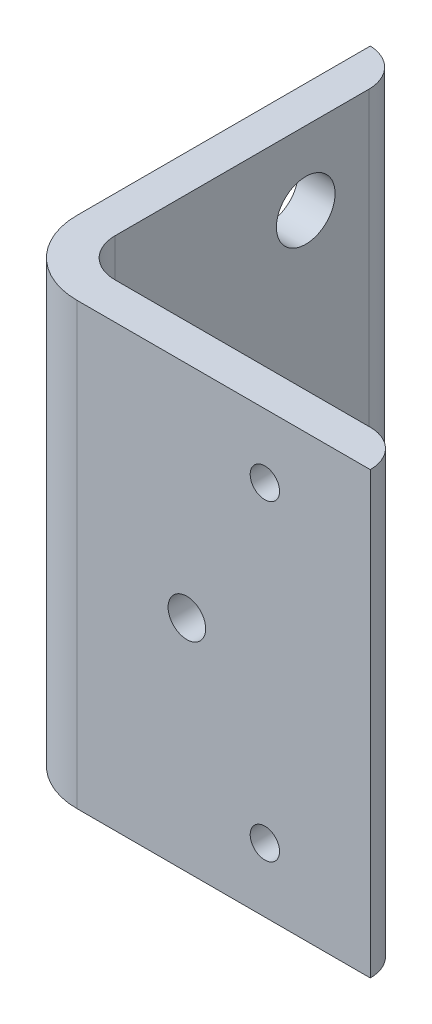
ISO-10303-21;
HEADER;
FILE_DESCRIPTION(('STEP AP214'),'2;1');
FILE_NAME('part.step','',(''),(''),'','','');
FILE_SCHEMA(('AUTOMOTIVE_DESIGN { 1 0 10303 214 1 1 1 1 }'));
ENDSEC;
DATA;
#1=APPLICATION_CONTEXT('core data for automotive mechanical design processes');
#2=APPLICATION_PROTOCOL_DEFINITION('international standard','automotive_design',2000,#1);
#3=PRODUCT_CONTEXT('',#1,'mechanical');
#4=PRODUCT('Part','Part','',(#3));
#5=PRODUCT_RELATED_PRODUCT_CATEGORY('part','',(#4));
#6=PRODUCT_DEFINITION_FORMATION('','',#4);
#7=PRODUCT_DEFINITION_CONTEXT('part definition',#1,'design');
#8=PRODUCT_DEFINITION('design','',#6,#7);
#9=PRODUCT_DEFINITION_SHAPE('','',#8);
#10=(LENGTH_UNIT() NAMED_UNIT(*) SI_UNIT(.MILLI.,.METRE.));
#11=(NAMED_UNIT(*) PLANE_ANGLE_UNIT() SI_UNIT($,.RADIAN.));
#12=(NAMED_UNIT(*) SI_UNIT($,.STERADIAN.) SOLID_ANGLE_UNIT());
#13=UNCERTAINTY_MEASURE_WITH_UNIT(LENGTH_MEASURE(1.E-05),#10,'distance_accuracy_value','');
#14=(GEOMETRIC_REPRESENTATION_CONTEXT(3) GLOBAL_UNCERTAINTY_ASSIGNED_CONTEXT((#13)) GLOBAL_UNIT_ASSIGNED_CONTEXT((#10,
#11,#12)) REPRESENTATION_CONTEXT('',''));
#15=CARTESIAN_POINT('',(0.,0.,0.));
#16=DIRECTION('',(0.,0.,1.));
#17=DIRECTION('',(1.,0.,0.));
#18=AXIS2_PLACEMENT_3D('',#15,#16,#17);
#19=CARTESIAN_POINT('',(-12.7,12.7,-19.812));
#20=DIRECTION('',(1.,0.,0.));
#21=DIRECTION('',(0.,0.,-1.));
#22=AXIS2_PLACEMENT_3D('',#19,#20,#21);
#23=CYLINDRICAL_SURFACE('',#22,2.54);
#24=CARTESIAN_POINT('',(-12.7,12.7,-19.812));
#25=DIRECTION('',(1.,0.,0.));
#26=DIRECTION('',(0.,0.,-1.));
#27=AXIS2_PLACEMENT_3D('',#24,#25,#26);
#28=CIRCLE('',#27,2.54);
#29=CARTESIAN_POINT('',(-12.7,12.7,-22.352));
#30=VERTEX_POINT('',#29);
#31=EDGE_CURVE('E19',#30,#30,#28,.F.);
#32=ORIENTED_EDGE('',*,*,#31,.F.);
#33=EDGE_LOOP('',(#32));
#34=FACE_BOUND('',#33,.T.);
#35=CARTESIAN_POINT('',(-15.875,12.7,-19.812));
#36=DIRECTION('',(1.,0.,0.));
#37=DIRECTION('',(0.,0.,-1.));
#38=AXIS2_PLACEMENT_3D('',#35,#36,#37);
#39=CIRCLE('',#38,2.54);
#40=CARTESIAN_POINT('',(-15.875,12.7,-22.352));
#41=VERTEX_POINT('',#40);
#42=EDGE_CURVE('E113',#41,#41,#39,.T.);
#43=ORIENTED_EDGE('',*,*,#42,.F.);
#44=EDGE_LOOP('',(#43));
#45=FACE_BOUND('',#44,.T.);
#46=ADVANCED_FACE('F16',(#34,#45),#23,.F.);
#47=CARTESIAN_POINT('',(-12.7,-12.7,-19.812));
#48=DIRECTION('',(1.,0.,0.));
#49=DIRECTION('',(0.,0.,-1.));
#50=AXIS2_PLACEMENT_3D('',#47,#48,#49);
#51=CYLINDRICAL_SURFACE('',#50,2.54);
#52=CARTESIAN_POINT('',(-12.7,-12.7,-19.812));
#53=DIRECTION('',(1.,0.,0.));
#54=DIRECTION('',(0.,0.,-1.));
#55=AXIS2_PLACEMENT_3D('',#52,#53,#54);
#56=CIRCLE('',#55,2.54);
#57=CARTESIAN_POINT('',(-12.7,-12.7,-22.352));
#58=VERTEX_POINT('',#57);
#59=EDGE_CURVE('E116',#58,#58,#56,.F.);
#60=ORIENTED_EDGE('',*,*,#59,.F.);
#61=EDGE_LOOP('',(#60));
#62=FACE_BOUND('',#61,.T.);
#63=CARTESIAN_POINT('',(-15.875,-12.7,-19.812));
#64=DIRECTION('',(1.,0.,0.));
#65=DIRECTION('',(0.,0.,-1.));
#66=AXIS2_PLACEMENT_3D('',#63,#64,#65);
#67=CIRCLE('',#66,2.54);
#68=CARTESIAN_POINT('',(-15.875,-12.7,-22.352));
#69=VERTEX_POINT('',#68);
#70=EDGE_CURVE('E92',#69,#69,#67,.T.);
#71=ORIENTED_EDGE('',*,*,#70,.F.);
#72=EDGE_LOOP('',(#71));
#73=FACE_BOUND('',#72,.T.);
#74=ADVANCED_FACE('F312',(#62,#73),#51,.F.);
#75=CARTESIAN_POINT('',(-9.398,68.71716,-3.302));
#76=DIRECTION('',(0.,-1.,0.));
#77=DIRECTION('',(0.,0.,-1.));
#78=AXIS2_PLACEMENT_3D('',#75,#76,#77);
#79=CYLINDRICAL_SURFACE('',#78,3.302);
#80=DIRECTION('',(0.,1.,0.));
#81=VECTOR('',#80,1.);
#82=CARTESIAN_POINT('',(-12.7,-19.05,-3.302));
#83=LINE('',#82,#81);
#84=CARTESIAN_POINT('',(-12.7,19.05,-3.302));
#85=VERTEX_POINT('',#84);
#86=CARTESIAN_POINT('',(-12.7,-19.05,-3.302));
#87=VERTEX_POINT('',#86);
#88=EDGE_CURVE('E75',#85,#87,#83,.F.);
#89=ORIENTED_EDGE('',*,*,#88,.F.);
#90=CARTESIAN_POINT('',(-9.398,19.05,-3.302));
#91=DIRECTION('',(0.,-1.,0.));
#92=DIRECTION('',(0.,0.,-1.));
#93=AXIS2_PLACEMENT_3D('',#90,#91,#92);
#94=CIRCLE('',#93,3.302);
#95=CARTESIAN_POINT('',(-9.398,19.05,0.));
#96=VERTEX_POINT('',#95);
#97=EDGE_CURVE('E87',#96,#85,#94,.T.);
#98=ORIENTED_EDGE('',*,*,#97,.F.);
#99=DIRECTION('',(0.,1.,0.));
#100=VECTOR('',#99,1.);
#101=CARTESIAN_POINT('',(-9.398,0.,0.));
#102=LINE('',#101,#100);
#103=CARTESIAN_POINT('',(-9.398,-19.05,0.));
#104=VERTEX_POINT('',#103);
#105=EDGE_CURVE('E80',#96,#104,#102,.F.);
#106=ORIENTED_EDGE('',*,*,#105,.T.);
#107=CARTESIAN_POINT('',(-9.398,-19.05,-3.302));
#108=DIRECTION('',(0.,-1.,0.));
#109=DIRECTION('',(0.,0.,-1.));
#110=AXIS2_PLACEMENT_3D('',#107,#108,#109);
#111=CIRCLE('',#110,3.302);
#112=EDGE_CURVE('E84',#87,#104,#111,.F.);
#113=ORIENTED_EDGE('',*,*,#112,.F.);
#114=EDGE_LOOP('',(#89,#98,#106,#113));
#115=FACE_BOUND('',#114,.T.);
#116=ADVANCED_FACE('F82',(#115),#79,.F.);
#117=CARTESIAN_POINT('',(-12.7,-19.05,3.175));
#118=DIRECTION('',(1.,0.,0.));
#119=DIRECTION('',(0.,0.,-1.));
#120=AXIS2_PLACEMENT_3D('',#117,#118,#119);
#121=PLANE('',#120);
#122=ORIENTED_EDGE('',*,*,#59,.T.);
#123=EDGE_LOOP('',(#122));
#124=FACE_BOUND('',#123,.T.);
#125=ORIENTED_EDGE('',*,*,#31,.T.);
#126=EDGE_LOOP('',(#125));
#127=FACE_BOUND('',#126,.T.);
#128=DIRECTION('',(0.,0.,-1.));
#129=VECTOR('',#128,1.);
#130=CARTESIAN_POINT('',(-12.7,-19.05,0.));
#131=LINE('',#130,#129);
#132=CARTESIAN_POINT('',(-12.7,-19.05,-25.2754432115813));
#133=VERTEX_POINT('',#132);
#134=EDGE_CURVE('E91',#133,#87,#131,.F.);
#135=ORIENTED_EDGE('',*,*,#134,.F.);
#136=DIRECTION('',(0.,-1.,0.));
#137=VECTOR('',#136,1.);
#138=CARTESIAN_POINT('',(-12.7,68.9720626903736,-25.2754432115813));
#139=LINE('',#138,#137);
#140=CARTESIAN_POINT('',(-12.7,19.05,-25.2754432115813));
#141=VERTEX_POINT('',#140);
#142=EDGE_CURVE('E118',#141,#133,#139,.T.);
#143=ORIENTED_EDGE('',*,*,#142,.F.);
#144=DIRECTION('',(0.,0.,1.));
#145=VECTOR('',#144,1.);
#146=CARTESIAN_POINT('',(-12.7,19.05,0.));
#147=LINE('',#146,#145);
#148=EDGE_CURVE('E156',#85,#141,#147,.F.);
#149=ORIENTED_EDGE('',*,*,#148,.F.);
#150=ORIENTED_EDGE('',*,*,#88,.T.);
#151=EDGE_LOOP('',(#135,#143,#149,#150));
#152=FACE_BOUND('',#151,.T.);
#153=ADVANCED_FACE('F296',(#124,#127,#152),#121,.T.);
#154=CARTESIAN_POINT('',(-16.002,68.9720626903736,-25.2754432115813));
#155=DIRECTION('',(0.,-1.,0.));
#156=DIRECTION('',(0.,0.,-1.));
#157=AXIS2_PLACEMENT_3D('',#154,#155,#156);
#158=CYLINDRICAL_SURFACE('',#157,3.302);
#159=ORIENTED_EDGE('',*,*,#142,.T.);
#160=CARTESIAN_POINT('',(-16.002,-19.05,-25.2754432115813));
#161=DIRECTION('',(0.,-1.,0.));
#162=DIRECTION('',(0.,0.,-1.));
#163=AXIS2_PLACEMENT_3D('',#160,#161,#162);
#164=CIRCLE('',#163,3.302);
#165=CARTESIAN_POINT('',(-15.875,-19.05,-28.575));
#166=VERTEX_POINT('',#165);
#167=EDGE_CURVE('E109',#166,#133,#164,.T.);
#168=ORIENTED_EDGE('',*,*,#167,.F.);
#169=DIRECTION('',(0.,1.,0.));
#170=VECTOR('',#169,1.);
#171=CARTESIAN_POINT('',(-15.875,19.05,-28.575));
#172=LINE('',#171,#170);
#173=CARTESIAN_POINT('',(-15.875,19.05,-28.575));
#174=VERTEX_POINT('',#173);
#175=EDGE_CURVE('E115',#174,#166,#172,.F.);
#176=ORIENTED_EDGE('',*,*,#175,.F.);
#177=CARTESIAN_POINT('',(-16.002,19.05,-25.2754432115813));
#178=DIRECTION('',(0.,-1.,0.));
#179=DIRECTION('',(0.,0.,-1.));
#180=AXIS2_PLACEMENT_3D('',#177,#178,#179);
#181=CIRCLE('',#180,3.302);
#182=EDGE_CURVE('E153',#141,#174,#181,.F.);
#183=ORIENTED_EDGE('',*,*,#182,.F.);
#184=EDGE_LOOP('',(#159,#168,#176,#183));
#185=FACE_BOUND('',#184,.T.);
#186=ADVANCED_FACE('F287',(#185),#158,.T.);
#187=CARTESIAN_POINT('',(-15.875,19.05,0.));
#188=DIRECTION('',(-1.,0.,0.));
#189=DIRECTION('',(0.,0.,1.));
#190=AXIS2_PLACEMENT_3D('',#187,#188,#189);
#191=PLANE('',#190);
#192=ORIENTED_EDGE('',*,*,#70,.T.);
#193=EDGE_LOOP('',(#192));
#194=FACE_BOUND('',#193,.T.);
#195=ORIENTED_EDGE('',*,*,#42,.T.);
#196=EDGE_LOOP('',(#195));
#197=FACE_BOUND('',#196,.T.);
#198=DIRECTION('',(0.,0.,1.));
#199=VECTOR('',#198,1.);
#200=CARTESIAN_POINT('',(-15.875,19.05,0.));
#201=LINE('',#200,#199);
#202=CARTESIAN_POINT('',(-15.875,19.05,-3.175));
#203=VERTEX_POINT('',#202);
#204=EDGE_CURVE('E161',#174,#203,#201,.T.);
#205=ORIENTED_EDGE('',*,*,#204,.F.);
#206=ORIENTED_EDGE('',*,*,#175,.T.);
#207=DIRECTION('',(0.,0.,-1.));
#208=VECTOR('',#207,1.);
#209=CARTESIAN_POINT('',(-15.875,-19.05,0.));
#210=LINE('',#209,#208);
#211=CARTESIAN_POINT('',(-15.875,-19.05,-3.175));
#212=VERTEX_POINT('',#211);
#213=EDGE_CURVE('E100',#212,#166,#210,.T.);
#214=ORIENTED_EDGE('',*,*,#213,.F.);
#215=DIRECTION('',(0.,-1.,0.));
#216=VECTOR('',#215,1.);
#217=CARTESIAN_POINT('',(-15.875,68.71716,-3.175));
#218=LINE('',#217,#216);
#219=EDGE_CURVE('E151',#203,#212,#218,.T.);
#220=ORIENTED_EDGE('',*,*,#219,.F.);
#221=EDGE_LOOP('',(#205,#206,#214,#220));
#222=FACE_BOUND('',#221,.T.);
#223=ADVANCED_FACE('F186',(#194,#197,#222),#191,.T.);
#224=CARTESIAN_POINT('',(0.,0.,0.));
#225=DIRECTION('',(0.,0.,1.));
#226=DIRECTION('',(1.,0.,0.));
#227=AXIS2_PLACEMENT_3D('',#224,#225,#226);
#228=PLANE('',#227);
#229=CARTESIAN_POINT('',(6.7499992,-13.4999984,0.));
#230=DIRECTION('',(0.,0.,-1.));
#231=DIRECTION('',(-1.,0.,0.));
#232=AXIS2_PLACEMENT_3D('',#229,#230,#231);
#233=CIRCLE('',#232,1.27);
#234=CARTESIAN_POINT('',(5.4799992,-13.4999984,0.));
#235=VERTEX_POINT('',#234);
#236=EDGE_CURVE('E138',#235,#235,#233,.F.);
#237=ORIENTED_EDGE('',*,*,#236,.T.);
#238=EDGE_LOOP('',(#237));
#239=FACE_BOUND('',#238,.T.);
#240=CARTESIAN_POINT('',(6.7499992,13.4999984,0.));
#241=DIRECTION('',(0.,0.,-1.));
#242=DIRECTION('',(-1.,0.,0.));
#243=AXIS2_PLACEMENT_3D('',#240,#241,#242);
#244=CIRCLE('',#243,1.27);
#245=CARTESIAN_POINT('',(5.4799992,13.4999984,0.));
#246=VERTEX_POINT('',#245);
#247=EDGE_CURVE('E142',#246,#246,#244,.F.);
#248=ORIENTED_EDGE('',*,*,#247,.T.);
#249=EDGE_LOOP('',(#248));
#250=FACE_BOUND('',#249,.T.);
#251=CARTESIAN_POINT('',(0.,0.,0.));
#252=DIRECTION('',(0.,0.,-1.));
#253=DIRECTION('',(-1.,0.,0.));
#254=AXIS2_PLACEMENT_3D('',#251,#252,#253);
#255=CIRCLE('',#254,1.62433);
#256=CARTESIAN_POINT('',(-1.62433,0.,0.));
#257=VERTEX_POINT('',#256);
#258=EDGE_CURVE('E145',#257,#257,#255,.F.);
#259=ORIENTED_EDGE('',*,*,#258,.T.);
#260=EDGE_LOOP('',(#259));
#261=FACE_BOUND('',#260,.T.);
#262=ORIENTED_EDGE('',*,*,#105,.F.);
#263=DIRECTION('',(1.,0.,0.));
#264=VECTOR('',#263,1.);
#265=CARTESIAN_POINT('',(15.875,19.05,0.));
#266=LINE('',#265,#264);
#267=CARTESIAN_POINT('',(12.7,19.05,0.));
#268=VERTEX_POINT('',#267);
#269=EDGE_CURVE('E158',#268,#96,#266,.F.);
#270=ORIENTED_EDGE('',*,*,#269,.F.);
#271=DIRECTION('',(0.,-1.,0.));
#272=VECTOR('',#271,1.);
#273=CARTESIAN_POINT('',(12.7,68.71716,0.));
#274=LINE('',#273,#272);
#275=CARTESIAN_POINT('',(12.7,-19.05,0.));
#276=VERTEX_POINT('',#275);
#277=EDGE_CURVE('E97',#276,#268,#274,.F.);
#278=ORIENTED_EDGE('',*,*,#277,.F.);
#279=DIRECTION('',(1.,0.,0.));
#280=VECTOR('',#279,1.);
#281=CARTESIAN_POINT('',(-15.875,-19.05,0.));
#282=LINE('',#281,#280);
#283=EDGE_CURVE('E95',#104,#276,#282,.T.);
#284=ORIENTED_EDGE('',*,*,#283,.F.);
#285=EDGE_LOOP('',(#262,#270,#278,#284));
#286=FACE_BOUND('',#285,.T.);
#287=ADVANCED_FACE('F96',(#239,#250,#261,#286),#228,.F.);
#288=CARTESIAN_POINT('',(-15.875,-19.05,0.));
#289=DIRECTION('',(0.,-1.,0.));
#290=DIRECTION('',(0.,0.,-1.));
#291=AXIS2_PLACEMENT_3D('',#288,#289,#290);
#292=PLANE('',#291);
#293=ORIENTED_EDGE('',*,*,#213,.T.);
#294=ORIENTED_EDGE('',*,*,#167,.T.);
#295=ORIENTED_EDGE('',*,*,#134,.T.);
#296=ORIENTED_EDGE('',*,*,#112,.T.);
#297=ORIENTED_EDGE('',*,*,#283,.T.);
#298=CARTESIAN_POINT('',(12.7,-19.05,3.175));
#299=DIRECTION('',(0.,-1.,0.));
#300=DIRECTION('',(0.,0.,-1.));
#301=AXIS2_PLACEMENT_3D('',#298,#299,#300);
#302=CIRCLE('',#301,3.175);
#303=CARTESIAN_POINT('',(15.875,-19.05,3.175));
#304=VERTEX_POINT('',#303);
#305=EDGE_CURVE('E130',#304,#276,#302,.F.);
#306=ORIENTED_EDGE('',*,*,#305,.F.);
#307=DIRECTION('',(1.,0.,0.));
#308=VECTOR('',#307,1.);
#309=CARTESIAN_POINT('',(0.,-19.05,3.175));
#310=LINE('',#309,#308);
#311=CARTESIAN_POINT('',(-9.525,-19.05,3.175));
#312=VERTEX_POINT('',#311);
#313=EDGE_CURVE('E141',#312,#304,#310,.T.);
#314=ORIENTED_EDGE('',*,*,#313,.F.);
#315=CARTESIAN_POINT('',(-9.525,-19.05,-3.175));
#316=DIRECTION('',(0.,-1.,0.));
#317=DIRECTION('',(0.,0.,-1.));
#318=AXIS2_PLACEMENT_3D('',#315,#316,#317);
#319=CIRCLE('',#318,6.35);
#320=EDGE_CURVE('E148',#212,#312,#319,.F.);
#321=ORIENTED_EDGE('',*,*,#320,.F.);
#322=EDGE_LOOP('',(#293,#294,#295,#296,#297,#306,#314,#321));
#323=FACE_BOUND('',#322,.T.);
#324=ADVANCED_FACE('F103',(#323),#292,.T.);
#325=CARTESIAN_POINT('',(12.7,68.71716,3.175));
#326=DIRECTION('',(0.,-1.,0.));
#327=DIRECTION('',(0.,0.,-1.));
#328=AXIS2_PLACEMENT_3D('',#325,#326,#327);
#329=CYLINDRICAL_SURFACE('',#328,3.175);
#330=DIRECTION('',(0.,1.,0.));
#331=VECTOR('',#330,1.);
#332=CARTESIAN_POINT('',(15.875,0.,3.175));
#333=LINE('',#332,#331);
#334=CARTESIAN_POINT('',(15.875,19.05,3.175));
#335=VERTEX_POINT('',#334);
#336=EDGE_CURVE('E170',#304,#335,#333,.T.);
#337=ORIENTED_EDGE('',*,*,#336,.F.);
#338=ORIENTED_EDGE('',*,*,#305,.T.);
#339=ORIENTED_EDGE('',*,*,#277,.T.);
#340=CARTESIAN_POINT('',(12.7,19.05,3.175));
#341=DIRECTION('',(0.,-1.,0.));
#342=DIRECTION('',(0.,0.,-1.));
#343=AXIS2_PLACEMENT_3D('',#340,#341,#342);
#344=CIRCLE('',#343,3.175);
#345=EDGE_CURVE('E159',#335,#268,#344,.F.);
#346=ORIENTED_EDGE('',*,*,#345,.F.);
#347=EDGE_LOOP('',(#337,#338,#339,#346));
#348=FACE_BOUND('',#347,.T.);
#349=ADVANCED_FACE('F193',(#348),#329,.T.);
#350=CARTESIAN_POINT('',(15.875,19.05,0.));
#351=DIRECTION('',(0.,1.,0.));
#352=DIRECTION('',(0.,0.,1.));
#353=AXIS2_PLACEMENT_3D('',#350,#351,#352);
#354=PLANE('',#353);
#355=ORIENTED_EDGE('',*,*,#148,.T.);
#356=ORIENTED_EDGE('',*,*,#182,.T.);
#357=ORIENTED_EDGE('',*,*,#204,.T.);
#358=CARTESIAN_POINT('',(-9.525,19.05,-3.175));
#359=DIRECTION('',(0.,-1.,0.));
#360=DIRECTION('',(0.,0.,-1.));
#361=AXIS2_PLACEMENT_3D('',#358,#359,#360);
#362=CIRCLE('',#361,6.35);
#363=CARTESIAN_POINT('',(-9.525,19.05,3.175));
#364=VERTEX_POINT('',#363);
#365=EDGE_CURVE('E34',#364,#203,#362,.T.);
#366=ORIENTED_EDGE('',*,*,#365,.F.);
#367=DIRECTION('',(1.,0.,0.));
#368=VECTOR('',#367,1.);
#369=CARTESIAN_POINT('',(0.,19.05,3.175));
#370=LINE('',#369,#368);
#371=EDGE_CURVE('E173',#335,#364,#370,.F.);
#372=ORIENTED_EDGE('',*,*,#371,.F.);
#373=ORIENTED_EDGE('',*,*,#345,.T.);
#374=ORIENTED_EDGE('',*,*,#269,.T.);
#375=ORIENTED_EDGE('',*,*,#97,.T.);
#376=EDGE_LOOP('',(#355,#356,#357,#366,#372,#373,#374,#375));
#377=FACE_BOUND('',#376,.T.);
#378=ADVANCED_FACE('F192',(#377),#354,.T.);
#379=CARTESIAN_POINT('',(-9.525,68.71716,-3.175));
#380=DIRECTION('',(0.,-1.,0.));
#381=DIRECTION('',(0.,0.,-1.));
#382=AXIS2_PLACEMENT_3D('',#379,#380,#381);
#383=CYLINDRICAL_SURFACE('',#382,6.35);
#384=ORIENTED_EDGE('',*,*,#219,.T.);
#385=ORIENTED_EDGE('',*,*,#320,.T.);
#386=DIRECTION('',(0.,1.,0.));
#387=VECTOR('',#386,1.);
#388=CARTESIAN_POINT('',(-9.525,0.,3.175));
#389=LINE('',#388,#387);
#390=EDGE_CURVE('E137',#364,#312,#389,.F.);
#391=ORIENTED_EDGE('',*,*,#390,.F.);
#392=ORIENTED_EDGE('',*,*,#365,.T.);
#393=EDGE_LOOP('',(#384,#385,#391,#392));
#394=FACE_BOUND('',#393,.T.);
#395=ADVANCED_FACE('F182',(#394),#383,.T.);
#396=CARTESIAN_POINT('',(0.,0.,0.));
#397=DIRECTION('',(0.,0.,-1.));
#398=DIRECTION('',(-1.,0.,0.));
#399=AXIS2_PLACEMENT_3D('',#396,#397,#398);
#400=CYLINDRICAL_SURFACE('',#399,1.62433);
#401=CARTESIAN_POINT('',(0.,0.,3.175));
#402=DIRECTION('',(0.,0.,-1.));
#403=DIRECTION('',(-1.,0.,0.));
#404=AXIS2_PLACEMENT_3D('',#401,#402,#403);
#405=CIRCLE('',#404,1.62433);
#406=CARTESIAN_POINT('',(-1.62433,0.,3.175));
#407=VERTEX_POINT('',#406);
#408=EDGE_CURVE('E134',#407,#407,#405,.T.);
#409=ORIENTED_EDGE('',*,*,#408,.F.);
#410=EDGE_LOOP('',(#409));
#411=FACE_BOUND('',#410,.T.);
#412=ORIENTED_EDGE('',*,*,#258,.F.);
#413=EDGE_LOOP('',(#412));
#414=FACE_BOUND('',#413,.T.);
#415=ADVANCED_FACE('F217',(#411,#414),#400,.F.);
#416=CARTESIAN_POINT('',(6.7499992,13.4999984,0.));
#417=DIRECTION('',(0.,0.,-1.));
#418=DIRECTION('',(-1.,0.,0.));
#419=AXIS2_PLACEMENT_3D('',#416,#417,#418);
#420=CYLINDRICAL_SURFACE('',#419,1.27);
#421=CARTESIAN_POINT('',(6.7499992,13.4999984,3.175));
#422=DIRECTION('',(0.,0.,-1.));
#423=DIRECTION('',(-1.,0.,0.));
#424=AXIS2_PLACEMENT_3D('',#421,#422,#423);
#425=CIRCLE('',#424,1.27);
#426=CARTESIAN_POINT('',(5.4799992,13.4999984,3.175));
#427=VERTEX_POINT('',#426);
#428=EDGE_CURVE('E25',#427,#427,#425,.T.);
#429=ORIENTED_EDGE('',*,*,#428,.F.);
#430=EDGE_LOOP('',(#429));
#431=FACE_BOUND('',#430,.T.);
#432=ORIENTED_EDGE('',*,*,#247,.F.);
#433=EDGE_LOOP('',(#432));
#434=FACE_BOUND('',#433,.T.);
#435=ADVANCED_FACE('F210',(#431,#434),#420,.F.);
#436=CARTESIAN_POINT('',(6.7499992,-13.4999984,0.));
#437=DIRECTION('',(0.,0.,-1.));
#438=DIRECTION('',(-1.,0.,0.));
#439=AXIS2_PLACEMENT_3D('',#436,#437,#438);
#440=CYLINDRICAL_SURFACE('',#439,1.27);
#441=CARTESIAN_POINT('',(6.7499992,-13.4999984,3.175));
#442=DIRECTION('',(0.,0.,-1.));
#443=DIRECTION('',(-1.,0.,0.));
#444=AXIS2_PLACEMENT_3D('',#441,#442,#443);
#445=CIRCLE('',#444,1.27);
#446=CARTESIAN_POINT('',(5.4799992,-13.4999984,3.175));
#447=VERTEX_POINT('',#446);
#448=EDGE_CURVE('E11',#447,#447,#445,.T.);
#449=ORIENTED_EDGE('',*,*,#448,.F.);
#450=EDGE_LOOP('',(#449));
#451=FACE_BOUND('',#450,.T.);
#452=ORIENTED_EDGE('',*,*,#236,.F.);
#453=EDGE_LOOP('',(#452));
#454=FACE_BOUND('',#453,.T.);
#455=ADVANCED_FACE('F204',(#451,#454),#440,.F.);
#456=CARTESIAN_POINT('',(0.,0.,3.175));
#457=DIRECTION('',(0.,0.,1.));
#458=DIRECTION('',(1.,0.,0.));
#459=AXIS2_PLACEMENT_3D('',#456,#457,#458);
#460=PLANE('',#459);
#461=ORIENTED_EDGE('',*,*,#448,.T.);
#462=EDGE_LOOP('',(#461));
#463=FACE_BOUND('',#462,.T.);
#464=ORIENTED_EDGE('',*,*,#428,.T.);
#465=EDGE_LOOP('',(#464));
#466=FACE_BOUND('',#465,.T.);
#467=ORIENTED_EDGE('',*,*,#408,.T.);
#468=EDGE_LOOP('',(#467));
#469=FACE_BOUND('',#468,.T.);
#470=ORIENTED_EDGE('',*,*,#371,.T.);
#471=ORIENTED_EDGE('',*,*,#390,.T.);
#472=ORIENTED_EDGE('',*,*,#313,.T.);
#473=ORIENTED_EDGE('',*,*,#336,.T.);
#474=EDGE_LOOP('',(#470,#471,#472,#473));
#475=FACE_BOUND('',#474,.T.);
#476=ADVANCED_FACE('F190',(#463,#466,#469,#475),#460,.T.);
#477=CLOSED_SHELL('',(#46,#74,#116,#153,#186,#223,#287,#324,#349,#378,#395,#415,#435,#455,#476));
#478=MANIFOLD_SOLID_BREP('B1',#477);
#479=ADVANCED_BREP_SHAPE_REPRESENTATION('',(#18,#478),#14);
#480=SHAPE_DEFINITION_REPRESENTATION(#9,#479);
ENDSEC;
END-ISO-10303-21;
